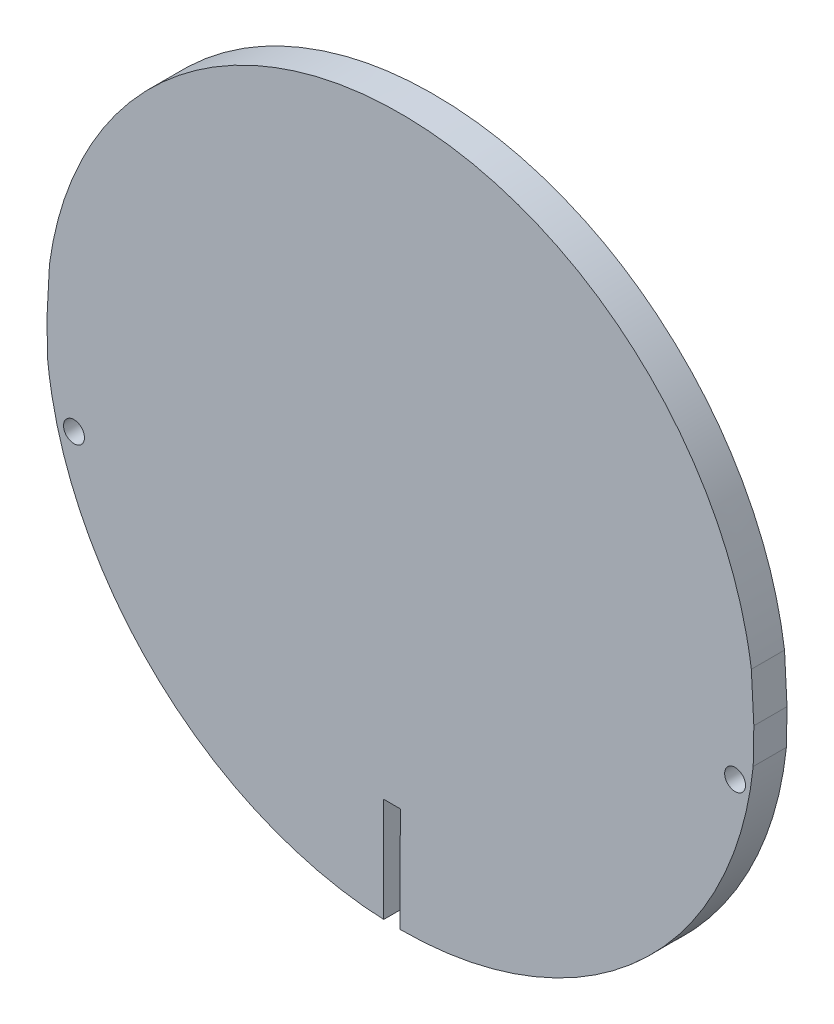
ISO-10303-21;
HEADER;
FILE_DESCRIPTION(('STEP AP214'),'2;1');
FILE_NAME('part.step','',(''),(''),'','','');
FILE_SCHEMA(('AUTOMOTIVE_DESIGN { 1 0 10303 214 1 1 1 1 }'));
ENDSEC;
DATA;
#1=APPLICATION_CONTEXT('core data for automotive mechanical design processes');
#2=APPLICATION_PROTOCOL_DEFINITION('international standard','automotive_design',2000,#1);
#3=PRODUCT_CONTEXT('',#1,'mechanical');
#4=PRODUCT('Part','Part','',(#3));
#5=PRODUCT_RELATED_PRODUCT_CATEGORY('part','',(#4));
#6=PRODUCT_DEFINITION_FORMATION('','',#4);
#7=PRODUCT_DEFINITION_CONTEXT('part definition',#1,'design');
#8=PRODUCT_DEFINITION('design','',#6,#7);
#9=PRODUCT_DEFINITION_SHAPE('','',#8);
#10=(LENGTH_UNIT() NAMED_UNIT(*) SI_UNIT(.MILLI.,.METRE.));
#11=(NAMED_UNIT(*) PLANE_ANGLE_UNIT() SI_UNIT($,.RADIAN.));
#12=(NAMED_UNIT(*) SI_UNIT($,.STERADIAN.) SOLID_ANGLE_UNIT());
#13=UNCERTAINTY_MEASURE_WITH_UNIT(LENGTH_MEASURE(1.E-05),#10,'distance_accuracy_value','');
#14=(GEOMETRIC_REPRESENTATION_CONTEXT(3) GLOBAL_UNCERTAINTY_ASSIGNED_CONTEXT((#13)) GLOBAL_UNIT_ASSIGNED_CONTEXT((#10,
#11,#12)) REPRESENTATION_CONTEXT('',''));
#15=CARTESIAN_POINT('',(0.,0.,0.));
#16=DIRECTION('',(0.,0.,1.));
#17=DIRECTION('',(1.,0.,0.));
#18=AXIS2_PLACEMENT_3D('',#15,#16,#17);
#19=CARTESIAN_POINT('',(-33.7401472515028,-3.41884717440255,374.0343746217));
#20=CARTESIAN_POINT('',(-33.5219134346699,-5.49673974408785,374.0343746217));
#21=CARTESIAN_POINT('',(-33.1217586079544,-7.52360336030338,374.0343746217));
#22=CARTESIAN_POINT('',(-32.2456554666281,-10.4865168297179,374.0343746217));
#23=CARTESIAN_POINT('',(-31.7386470445697,-11.9486311258385,374.0343746217));
#24=CARTESIAN_POINT('',(-31.1277553781005,-13.3816061089751,374.0343746217));
#25=CARTESIAN_POINT('',(-30.6973662683452,-14.3304353467333,374.0343746217));
#26=CARTESIAN_POINT('',(-30.4703785723469,-14.8019000588231,374.0343746217));
#27=CARTESIAN_POINT('',(-29.2902117325403,-17.1196124406314,374.0343746217));
#28=CARTESIAN_POINT('',(-27.6449305064317,-19.7403337772427,374.0343746217));
#29=CARTESIAN_POINT('',(-25.646898465304,-22.1138572841173,374.0343746217));
#30=CARTESIAN_POINT('',(-24.5883768170115,-23.2589191706647,374.0343746217));
#31=CARTESIAN_POINT('',(-24.2247269148998,-23.6345217184511,374.0343746217));
#32=CARTESIAN_POINT('',(-23.4820127847481,-24.3673271482495,374.0343746217));
#33=CARTESIAN_POINT('',(-21.5901477401273,-26.1504244492688,374.0343746217));
#34=CARTESIAN_POINT('',(-18.7056708268071,-28.3178618450069,374.0343746217));
#35=CARTESIAN_POINT('',(-15.9807867113066,-29.8236057129874,374.0343746217));
#36=CARTESIAN_POINT('',(-14.1070067716983,-30.7476866698165,374.0343746217));
#37=CARTESIAN_POINT('',(-13.1527010835454,-31.164175695453,374.0343746217));
#38=CARTESIAN_POINT('',(-10.2562424757701,-32.2793477501952,374.0343746217));
#39=CARTESIAN_POINT('',(-7.77796089328067,-32.988270972225,374.0343746217));
#40=CARTESIAN_POINT('',(-5.21433965591233,-33.4058998082986,374.0343746217));
#41=CARTESIAN_POINT('',(-4.18196798537004,-33.5493200990036,374.0343746217));
#42=CARTESIAN_POINT('',(-3.66132830753749,-33.6092558601464,374.0343746217));
#43=CARTESIAN_POINT('',(-2.10453268143531,-33.7519977589989,374.0343746217));
#44=CARTESIAN_POINT('',(-1.06921386927955,-33.7985427644596,374.0343746217));
#45=CARTESIAN_POINT('',(2.02959764384909,-33.8016874715165,374.0343746217));
#46=CARTESIAN_POINT('',(4.08596214071679,-33.6221162532679,374.0343746217));
#47=CARTESIAN_POINT('',(7.15511700382936,-33.0587264934906,374.0343746217));
#48=CARTESIAN_POINT('',(8.17808125657162,-32.8206708517667,374.0343746217));
#49=CARTESIAN_POINT('',(10.1770009779513,-32.2565776331426,374.0343746217));
#50=CARTESIAN_POINT('',(11.1581047667066,-31.9298887420901,374.0343746217));
#51=CARTESIAN_POINT('',(14.0493649699348,-30.823232747779,374.0343746217));
#52=CARTESIAN_POINT('',(15.9079360314546,-29.9178091814807,374.0343746217));
#53=CARTESIAN_POINT('',(18.1367329395038,-28.5564061577701,374.0343746217));
#54=CARTESIAN_POINT('',(18.5768891041864,-28.2730876142728,374.0343746217));
#55=CARTESIAN_POINT('',(19.4387101347957,-27.6894607286162,374.0343746217));
#56=CARTESIAN_POINT('',(20.7069732529225,-26.7865737608581,374.0343746217));
#57=CARTESIAN_POINT('',(21.9036315165537,-25.8033664460532,374.0343746217));
#58=CARTESIAN_POINT('',(23.438553372088,-24.4244221054054,374.0343746217));
#59=CARTESIAN_POINT('',(24.5444118429601,-23.3393631645124,374.0343746217));
#60=CARTESIAN_POINT('',(25.5786405388952,-22.1739559229024,374.0343746217));
#61=CARTESIAN_POINT('',(26.251776295938,-21.3786776518443,374.0343746217));
#62=CARTESIAN_POINT('',(26.5809697228596,-20.9707785150517,374.0343746217));
#63=CARTESIAN_POINT('',(28.1709466197994,-18.9029253335801,374.0343746217));
#64=CARTESIAN_POINT('',(29.269671396597,-17.1528992217387,374.0343746217));
#65=CARTESIAN_POINT('',(30.6789072870612,-14.3958682316347,374.0343746217));
#66=CARTESIAN_POINT('',(31.1088211759449,-13.45484663067,374.0343746217));
#67=CARTESIAN_POINT('',(31.8840533739668,-11.5260549877065,374.0343746217));
#68=CARTESIAN_POINT('',(32.230015293159,-10.5349072164197,374.0343746217));
#69=CARTESIAN_POINT('',(33.1196381142277,-7.53930280297371,374.0343746217));
#70=CARTESIAN_POINT('',(33.5216512280803,-5.49956295766788,374.0343746217));
#71=CARTESIAN_POINT('',(33.7401820483116,-3.41884711737329,374.0343746217));
#72=B_SPLINE_CURVE_WITH_KNOTS('',3,(#19,#20,#21,#22,#23,#24,#25,#26,#27,#28,#29,#30,#31,#32,#33,
#34,#35,#36,#37,#38,#39,#40,#41,#42,#43,#44,#45,#46,#47,#48,#49,#50,#51,#52,#53,#54,#55,#56,#57,
#58,#59,#60,#61,#62,#63,#64,#65,#66,#67,#68,#69,#70,#71),.UNSPECIFIED.,.F.,.F.,(4,2,1,2,2,1,2,2,
1,1,2,2,1,2,2,2,2,2,2,2,2,1,2,1,2,2,2,2,2,4),(0.,0.0625000000000002,0.0937500000000003,0.109375,
0.125,0.187500000000001,0.218750000000001,0.234375000000001,0.250000000000001,0.312500000000001,
0.343750000000001,0.375000000000001,0.437500000000001,0.453125000000001,0.468750000000001,
0.500000000000001,0.5625,0.59375,0.625,0.6875,0.703125,0.71875,0.75,0.78125,0.796875,0.8125,
0.875,0.90625,0.9375,1.),.UNSPECIFIED.);
#73=DIRECTION('',(0.,0.,1.));
#74=VECTOR('',#73,1.);
#75=SURFACE_OF_LINEAR_EXTRUSION('',#72,#74);
#76=CARTESIAN_POINT('',(33.7401820483116,-3.41884711737329,377.2093746217));
#77=CARTESIAN_POINT('',(33.5216512280803,-5.49956295766788,377.2093746217));
#78=CARTESIAN_POINT('',(33.1196381142277,-7.53930280297371,377.2093746217));
#79=CARTESIAN_POINT('',(32.230015293159,-10.5349072164197,377.2093746217));
#80=CARTESIAN_POINT('',(31.8840533739668,-11.5260549877065,377.2093746217));
#81=CARTESIAN_POINT('',(31.1088211759449,-13.45484663067,377.2093746217));
#82=CARTESIAN_POINT('',(30.6789072870612,-14.3958682316347,377.2093746217));
#83=CARTESIAN_POINT('',(29.269671396597,-17.1528992217387,377.2093746217));
#84=CARTESIAN_POINT('',(28.1709466197994,-18.9029253335801,377.2093746217));
#85=CARTESIAN_POINT('',(26.5809697228596,-20.9707785150517,377.2093746217));
#86=CARTESIAN_POINT('',(26.251776295938,-21.3786776518443,377.2093746217));
#87=CARTESIAN_POINT('',(25.5786405388952,-22.1739559229024,377.2093746217));
#88=CARTESIAN_POINT('',(24.5444118429601,-23.3393631645124,377.2093746217));
#89=CARTESIAN_POINT('',(23.438553372088,-24.4244221054054,377.2093746217));
#90=CARTESIAN_POINT('',(21.9036315165537,-25.8033664460532,377.2093746217));
#91=CARTESIAN_POINT('',(20.7069732529225,-26.7865737608581,377.2093746217));
#92=CARTESIAN_POINT('',(19.4387101347957,-27.6894607286162,377.2093746217));
#93=CARTESIAN_POINT('',(18.5768891041864,-28.2730876142728,377.2093746217));
#94=CARTESIAN_POINT('',(18.1367329395038,-28.5564061577701,377.2093746217));
#95=CARTESIAN_POINT('',(15.9079360314546,-29.9178091814807,377.2093746217));
#96=CARTESIAN_POINT('',(14.0493649699348,-30.823232747779,377.2093746217));
#97=CARTESIAN_POINT('',(11.1581047667066,-31.9298887420901,377.2093746217));
#98=CARTESIAN_POINT('',(10.1770009779513,-32.2565776331426,377.2093746217));
#99=CARTESIAN_POINT('',(8.17808125657162,-32.8206708517667,377.2093746217));
#100=CARTESIAN_POINT('',(7.15511700382936,-33.0587264934906,377.2093746217));
#101=CARTESIAN_POINT('',(4.09178396282777,-33.6210475698332,377.2093746217));
#102=CARTESIAN_POINT('',(2.04129959814083,-33.8006640087557,377.2093746217));
#103=CARTESIAN_POINT('',(-0.0186426974678636,-33.7996044829551,377.2093746217));
#104=B_SPLINE_CURVE_WITH_KNOTS('',3,(#76,#77,#78,#79,#80,#81,#82,#83,#84,#85,#86,#87,#88,#89,
#90,#91,#92,#93,#94,#95,#96,#97,#98,#99,#100,#101,#102,#103),.UNSPECIFIED.,.F.,.F.,(4,2,2,2,2,2,
1,2,1,2,2,2,2,2,4),(0.500177832611012,0.562677832611011,0.593927832611011,0.625177832611011,
0.687677832611011,0.703302832611011,0.718927832611011,0.750177832611011,0.781427832611011,
0.797052832611011,0.812677832611011,0.875177832611011,0.906427832611011,0.937677832611011,1.),.UNSPECIFIED.);
#105=CARTESIAN_POINT('',(-0.0186426974562713,-33.7996044829551,377.2093746217));
#106=VERTEX_POINT('',#105);
#107=CARTESIAN_POINT('',(33.7401820483116,-3.41884711737329,377.2093746217));
#108=VERTEX_POINT('',#107);
#109=EDGE_CURVE('E277',#106,#108,#104,.F.);
#110=ORIENTED_EDGE('',*,*,#109,.F.);
#111=DIRECTION('',(0.,0.,1.));
#112=VECTOR('',#111,1.);
#113=CARTESIAN_POINT('',(-0.0186426974562744,-33.7996044829551,370.559262624631));
#114=LINE('',#113,#112);
#115=CARTESIAN_POINT('',(-0.0186426974562744,-33.7996044829551,374.0343746217));
#116=VERTEX_POINT('',#115);
#117=EDGE_CURVE('E314',#116,#106,#114,.T.);
#118=ORIENTED_EDGE('',*,*,#117,.F.);
#119=CARTESIAN_POINT('',(-0.0186426974458457,-33.7996044829551,374.0343746217));
#120=CARTESIAN_POINT('',(2.04129959815544,-33.8006640087544,374.0343746217));
#121=CARTESIAN_POINT('',(4.09178396283504,-33.6210475698319,374.0343746217));
#122=CARTESIAN_POINT('',(7.15511700382936,-33.0587264934906,374.0343746217));
#123=CARTESIAN_POINT('',(8.17808125657162,-32.8206708517667,374.0343746217));
#124=CARTESIAN_POINT('',(10.1770009779513,-32.2565776331426,374.0343746217));
#125=CARTESIAN_POINT('',(11.1581047667066,-31.9298887420901,374.0343746217));
#126=CARTESIAN_POINT('',(14.0493649699348,-30.823232747779,374.0343746217));
#127=CARTESIAN_POINT('',(15.9079360314546,-29.9178091814807,374.0343746217));
#128=CARTESIAN_POINT('',(18.1367329395038,-28.5564061577701,374.0343746217));
#129=CARTESIAN_POINT('',(18.5768891041864,-28.2730876142728,374.0343746217));
#130=CARTESIAN_POINT('',(19.4387101347957,-27.6894607286162,374.0343746217));
#131=CARTESIAN_POINT('',(20.7069732529225,-26.7865737608581,374.0343746217));
#132=CARTESIAN_POINT('',(21.9036315165537,-25.8033664460532,374.0343746217));
#133=CARTESIAN_POINT('',(23.438553372088,-24.4244221054054,374.0343746217));
#134=CARTESIAN_POINT('',(24.5444118429601,-23.3393631645124,374.0343746217));
#135=CARTESIAN_POINT('',(25.5786405388952,-22.1739559229024,374.0343746217));
#136=CARTESIAN_POINT('',(26.251776295938,-21.3786776518443,374.0343746217));
#137=CARTESIAN_POINT('',(26.5809697228596,-20.9707785150517,374.0343746217));
#138=CARTESIAN_POINT('',(28.1709466197994,-18.9029253335801,374.0343746217));
#139=CARTESIAN_POINT('',(29.269671396597,-17.1528992217387,374.0343746217));
#140=CARTESIAN_POINT('',(30.6789072870612,-14.3958682316347,374.0343746217));
#141=CARTESIAN_POINT('',(31.1088211759449,-13.45484663067,374.0343746217));
#142=CARTESIAN_POINT('',(31.8840533739668,-11.5260549877065,374.0343746217));
#143=CARTESIAN_POINT('',(32.230015293159,-10.5349072164197,374.0343746217));
#144=CARTESIAN_POINT('',(33.1196381142277,-7.53930280297371,374.0343746217));
#145=CARTESIAN_POINT('',(33.5216512280803,-5.49956295766788,374.0343746217));
#146=CARTESIAN_POINT('',(33.7401820483116,-3.41884711737329,374.0343746217));
#147=B_SPLINE_CURVE_WITH_KNOTS('',3,(#119,#120,#121,#122,#123,#124,#125,#126,#127,#128,#129,
#130,#131,#132,#133,#134,#135,#136,#137,#138,#139,#140,#141,#142,#143,#144,#145,#146),
.UNSPECIFIED.,.F.,.F.,(4,2,2,2,2,2,1,2,1,2,2,2,2,2,4),(0.500177832611233,0.5625,0.59375,0.625,
0.6875,0.703125,0.71875,0.75,0.78125,0.796875,0.8125,0.875,0.90625,0.9375,1.),.UNSPECIFIED.);
#148=CARTESIAN_POINT('',(33.7401820483116,-3.41884711737329,374.0343746217));
#149=VERTEX_POINT('',#148);
#150=EDGE_CURVE('E136',#116,#149,#147,.T.);
#151=ORIENTED_EDGE('',*,*,#150,.T.);
#152=DIRECTION('',(0.,0.,1.));
#153=VECTOR('',#152,1.);
#154=CARTESIAN_POINT('',(33.7401820483116,-3.41884711737329,374.0343746217));
#155=LINE('',#154,#153);
#156=EDGE_CURVE('E120',#149,#108,#155,.T.);
#157=ORIENTED_EDGE('',*,*,#156,.T.);
#158=EDGE_LOOP('',(#110,#118,#151,#157));
#159=FACE_BOUND('',#158,.T.);
#160=ADVANCED_FACE('F38',(#159),#75,.T.);
#161=CARTESIAN_POINT('',(-0.0362766982367262,-33.7995910001452,374.0343746217));
#162=DIRECTION('',(0.,0.,-1.));
#163=DIRECTION('',(-1.,0.,0.));
#164=AXIS2_PLACEMENT_3D('',#161,#162,#163);
#165=PLANE('',#164);
#166=CARTESIAN_POINT('',(32.0093023749139,-5.35898951564747,374.0343746217));
#167=DIRECTION('',(0.,0.,1.));
#168=DIRECTION('',(1.,0.,0.));
#169=AXIS2_PLACEMENT_3D('',#166,#167,#168);
#170=CIRCLE('',#169,0.999999999998764);
#171=CARTESIAN_POINT('',(33.0093023749126,-5.35898951564747,374.0343746217));
#172=VERTEX_POINT('',#171);
#173=EDGE_CURVE('E205',#172,#172,#170,.T.);
#174=ORIENTED_EDGE('',*,*,#173,.T.);
#175=EDGE_LOOP('',(#174));
#176=FACE_BOUND('',#175,.T.);
#177=CARTESIAN_POINT('',(-31.2160643993176,-8.16443665346959,374.0343746217));
#178=DIRECTION('',(0.,0.,1.));
#179=DIRECTION('',(1.,0.,0.));
#180=AXIS2_PLACEMENT_3D('',#177,#178,#179);
#181=CIRCLE('',#180,1.);
#182=CARTESIAN_POINT('',(-30.2160643993176,-8.16443665346959,374.0343746217));
#183=VERTEX_POINT('',#182);
#184=EDGE_CURVE('E234',#183,#183,#181,.T.);
#185=ORIENTED_EDGE('',*,*,#184,.T.);
#186=EDGE_LOOP('',(#185));
#187=FACE_BOUND('',#186,.T.);
#188=ORIENTED_EDGE('',*,*,#150,.F.);
#189=DIRECTION('',(-0.00055156546668725,-0.999999847887756,0.));
#190=VECTOR('',#189,1.);
#191=CARTESIAN_POINT('',(0.,0.,374.0343746217));
#192=LINE('',#191,#190);
#193=CARTESIAN_POINT('',(-0.0131270419666224,-23.7996045123723,374.0343746217));
#194=VERTEX_POINT('',#193);
#195=EDGE_CURVE('E337',#194,#116,#192,.T.);
#196=ORIENTED_EDGE('',*,*,#195,.F.);
#197=DIRECTION('',(1.,0.,0.));
#198=VECTOR('',#197,1.);
#199=CARTESIAN_POINT('',(0.,-23.7996045123723,374.0343746217));
#200=LINE('',#199,#198);
#201=CARTESIAN_POINT('',(-1.60062704196662,-23.7996045123723,374.0343746217));
#202=VERTEX_POINT('',#201);
#203=EDGE_CURVE('E341',#202,#194,#200,.T.);
#204=ORIENTED_EDGE('',*,*,#203,.F.);
#205=DIRECTION('',(0.,-1.,0.));
#206=VECTOR('',#205,1.);
#207=CARTESIAN_POINT('',(-1.60062704196663,0.,374.0343746217));
#208=LINE('',#207,#206);
#209=CARTESIAN_POINT('',(-1.60062704196662,-33.7628951620284,374.0343746217));
#210=VERTEX_POINT('',#209);
#211=EDGE_CURVE('E309',#202,#210,#208,.T.);
#212=ORIENTED_EDGE('',*,*,#211,.T.);
#213=CARTESIAN_POINT('',(-33.7401472515028,-3.41884717440255,374.0343746217));
#214=CARTESIAN_POINT('',(-33.5219134346699,-5.49673974408785,374.0343746217));
#215=CARTESIAN_POINT('',(-33.1217586079544,-7.52360336030338,374.0343746217));
#216=CARTESIAN_POINT('',(-32.2456554666281,-10.4865168297179,374.0343746217));
#217=CARTESIAN_POINT('',(-31.7386470445697,-11.9486311258385,374.0343746217));
#218=CARTESIAN_POINT('',(-31.1277553781005,-13.3816061089751,374.0343746217));
#219=CARTESIAN_POINT('',(-30.6973662683452,-14.3304353467333,374.0343746217));
#220=CARTESIAN_POINT('',(-30.4703785723469,-14.8019000588231,374.0343746217));
#221=CARTESIAN_POINT('',(-29.2902117325403,-17.1196124406314,374.0343746217));
#222=CARTESIAN_POINT('',(-27.6449305064317,-19.7403337772427,374.0343746217));
#223=CARTESIAN_POINT('',(-25.646898465304,-22.1138572841173,374.0343746217));
#224=CARTESIAN_POINT('',(-24.5883768170115,-23.2589191706647,374.0343746217));
#225=CARTESIAN_POINT('',(-24.2247269148998,-23.6345217184511,374.0343746217));
#226=CARTESIAN_POINT('',(-23.4820127847481,-24.3673271482495,374.0343746217));
#227=CARTESIAN_POINT('',(-21.5901477401273,-26.1504244492688,374.0343746217));
#228=CARTESIAN_POINT('',(-18.7056708268071,-28.3178618450069,374.0343746217));
#229=CARTESIAN_POINT('',(-15.9807867113066,-29.8236057129874,374.0343746217));
#230=CARTESIAN_POINT('',(-14.1070067716983,-30.7476866698165,374.0343746217));
#231=CARTESIAN_POINT('',(-13.1527010835454,-31.164175695453,374.0343746217));
#232=CARTESIAN_POINT('',(-10.2562424757701,-32.2793477501952,374.0343746217));
#233=CARTESIAN_POINT('',(-7.77796089328067,-32.988270972225,374.0343746217));
#234=CARTESIAN_POINT('',(-5.21433965591233,-33.4058998082986,374.0343746217));
#235=CARTESIAN_POINT('',(-4.18196798537004,-33.5493200990036,374.0343746217));
#236=CARTESIAN_POINT('',(-3.66132830753749,-33.6092558601464,374.0343746217));
#237=CARTESIAN_POINT('',(-2.62785466297365,-33.704014599165,374.0343746217));
#238=CARTESIAN_POINT('',(-2.1139384090079,-33.7392434143478,374.0343746217));
#239=CARTESIAN_POINT('',(-1.60062777177367,-33.7629030620113,374.0343746217));
#240=B_SPLINE_CURVE_WITH_KNOTS('',3,(#213,#214,#215,#216,#217,#218,#219,#220,#221,#222,#223,
#224,#225,#226,#227,#228,#229,#230,#231,#232,#233,#234,#235,#236,#237,#238,#239),.UNSPECIFIED.,
.F.,.F.,(4,2,1,2,2,1,2,2,1,1,2,2,1,2,2,4),(0.,0.0625000000000002,0.0937500000000003,0.109375,
0.125,0.187500000000001,0.218750000000001,0.234375000000001,0.250000000000001,0.312500000000001,
0.343750000000001,0.375000000000001,0.437500000000001,0.453125000000001,0.468750000000001,
0.48424281423116),.UNSPECIFIED.);
#241=CARTESIAN_POINT('',(-33.7401472515028,-3.41884717440255,374.0343746217));
#242=VERTEX_POINT('',#241);
#243=EDGE_CURVE('E133',#242,#210,#240,.T.);
#244=ORIENTED_EDGE('',*,*,#243,.F.);
#245=DIRECTION('',(0.0174524064371546,-0.999847695156394,0.));
#246=VECTOR('',#245,1.);
#247=CARTESIAN_POINT('',(-33.7995254554744,-0.0170721471381322,374.0343746217));
#248=LINE('',#247,#246);
#249=CARTESIAN_POINT('',(-33.7995254554744,-0.0170721471381322,374.0343746217));
#250=VERTEX_POINT('',#249);
#251=EDGE_CURVE('E273',#250,#242,#248,.T.);
#252=ORIENTED_EDGE('',*,*,#251,.F.);
#253=DIRECTION('',(-0.052335956242939,-0.998629534754574,0.));
#254=VECTOR('',#253,1.);
#255=CARTESIAN_POINT('',(-33.560377663928,4.54613955192814,374.0343746217));
#256=LINE('',#255,#254);
#257=CARTESIAN_POINT('',(-33.560377663928,4.54613955192816,374.0343746217));
#258=VERTEX_POINT('',#257);
#259=EDGE_CURVE('E272',#258,#250,#256,.T.);
#260=ORIENTED_EDGE('',*,*,#259,.F.);
#261=CARTESIAN_POINT('',(33.5604124567753,4.54613960853345,374.0343746217));
#262=CARTESIAN_POINT('',(33.2820653987906,6.56737437943534,374.0343746217));
#263=CARTESIAN_POINT('',(32.8313728032903,8.53423069122965,374.0343746217));
#264=CARTESIAN_POINT('',(31.8946269220487,11.4022568974663,374.0343746217));
#265=CARTESIAN_POINT('',(31.3610874010579,12.8157086429951,374.0343746217));
#266=CARTESIAN_POINT('',(30.7294917793295,14.1982217304009,374.0343746217));
#267=CARTESIAN_POINT('',(30.2866101478498,15.1130131439712,374.0343746217));
#268=CARTESIAN_POINT('',(30.0537010753112,15.5679250066728,374.0343746217));
#269=CARTESIAN_POINT('',(28.8457427014744,17.8052952917493,374.0343746217));
#270=CARTESIAN_POINT('',(27.7361738495733,19.4878372692615,374.0343746217));
#271=CARTESIAN_POINT('',(25.8528558013397,21.8474990802839,374.0343746217));
#272=CARTESIAN_POINT('',(25.188593752061,22.6066980612392,374.0343746217));
#273=CARTESIAN_POINT('',(23.786460552021,24.0699135432291,374.0343746217));
#274=CARTESIAN_POINT('',(23.0450594456398,24.7766408289273,374.0343746217));
#275=CARTESIAN_POINT('',(20.7523281348932,26.7782840290484,374.0343746217));
#276=CARTESIAN_POINT('',(18.3110677460307,28.5581591218249,374.0343746217));
#277=CARTESIAN_POINT('',(15.6406478983997,29.9958772437517,374.0343746217));
#278=CARTESIAN_POINT('',(14.2667399957213,30.6569565242211,374.0343746217));
#279=CARTESIAN_POINT('',(13.8011410837962,30.8681630079769,374.0343746217));
#280=CARTESIAN_POINT('',(12.8647588873635,31.2679718529554,374.0343746217));
#281=CARTESIAN_POINT('',(12.3936994612774,31.4567831926255,374.0343746217));
#282=CARTESIAN_POINT('',(10.0246059650265,32.3474832889447,374.0343746217));
#283=CARTESIAN_POINT('',(7.11527976519426,33.1594712998069,374.0343746217));
#284=CARTESIAN_POINT('',(4.10232218038758,33.570671259807,374.0343746217));
#285=CARTESIAN_POINT('',(2.07021332223554,33.7540339641368,374.0343746217));
#286=CARTESIAN_POINT('',(1.05366216131143,33.7991469509523,374.0343746217));
#287=CARTESIAN_POINT('',(-1.97866322866921,33.8028023855291,374.0343746217));
#288=CARTESIAN_POINT('',(-4.48722038602584,33.5876812691688,374.0343746217));
#289=CARTESIAN_POINT('',(-6.9715007299331,33.0844091869291,374.0343746217));
#290=CARTESIAN_POINT('',(-7.96324362195128,32.8597266107306,374.0343746217));
#291=CARTESIAN_POINT('',(-8.4593996147349,32.7353306897467,374.0343746217));
#292=CARTESIAN_POINT('',(-9.93366921730277,32.3298054351655,374.0343746217));
#293=CARTESIAN_POINT('',(-10.8973653065333,32.016750487259,374.0343746217));
#294=CARTESIAN_POINT('',(-13.7346096462486,30.9575148612428,374.0343746217));
#295=CARTESIAN_POINT('',(-15.554750032773,30.0922358140582,374.0343746217));
#296=CARTESIAN_POINT('',(-17.7346735714331,28.7982272511699,374.0343746217));
#297=CARTESIAN_POINT('',(-18.1658935427174,28.5288002804764,374.0343746217));
#298=CARTESIAN_POINT('',(-19.0186453742721,27.9683420633217,374.0343746217));
#299=CARTESIAN_POINT('',(-19.4391876131215,27.677889019477,374.0343746217));
#300=CARTESIAN_POINT('',(-20.6739523625416,26.7831794449682,374.0343746217));
#301=CARTESIAN_POINT('',(-21.4652076756434,26.1530693842164,374.0343746217));
#302=CARTESIAN_POINT('',(-23.7487172604649,24.1676313965341,374.0343746217));
#303=CARTESIAN_POINT('',(-25.151109466385,22.7176111466286,374.0343746217));
#304=CARTESIAN_POINT('',(-26.7425075256197,20.7348077476841,374.0343746217));
#305=CARTESIAN_POINT('',(-27.0534367564324,20.3287028351869,374.0343746217));
#306=CARTESIAN_POINT('',(-27.6549586448929,19.5045017591262,374.0343746217));
#307=CARTESIAN_POINT('',(-28.5256821856912,18.2520117565887,374.0343746217));
#308=CARTESIAN_POINT('',(-29.3043492989201,16.9523012646445,374.0343746217));
#309=CARTESIAN_POINT('',(-30.7454836560348,14.293275374893,374.0343746217));
#310=CARTESIAN_POINT('',(-31.551336522558,12.4411335201558,374.0343746217));
#311=CARTESIAN_POINT('',(-32.506911863443,9.53303936882196,374.0343746217));
#312=CARTESIAN_POINT('',(-32.7810553240917,8.54772864691103,374.0343746217));
#313=CARTESIAN_POINT('',(-33.2376341924846,6.56190951935685,374.0343746217));
#314=CARTESIAN_POINT('',(-33.4209052816291,5.55892536190125,374.0343746217));
#315=CARTESIAN_POINT('',(-33.560377663928,4.54613955192816,374.0343746217));
#316=B_SPLINE_CURVE_WITH_KNOTS('',3,(#261,#262,#263,#264,#265,#266,#267,#268,#269,#270,#271,
#272,#273,#274,#275,#276,#277,#278,#279,#280,#281,#282,#283,#284,#285,#286,#287,#288,#289,#290,
#291,#292,#293,#294,#295,#296,#297,#298,#299,#300,#301,#302,#303,#304,#305,#306,#307,#308,#309,
#310,#311,#312,#313,#314,#315),.UNSPECIFIED.,.F.,.F.,(4,2,1,2,2,2,2,2,1,2,2,2,1,2,2,1,2,2,2,2,2,
2,2,2,2,1,2,2,2,4),(0.,0.0625,0.09375,0.109375,0.125,0.1875,0.21875,0.25,0.3125,0.34375,
0.359375,0.375,0.4375,0.46875,0.5,0.5625,0.578125,0.59375,0.625,0.6875,0.703125,0.71875,0.75,
0.8125,0.828125,0.84375,0.875,0.9375,0.96875,1.),.UNSPECIFIED.);
#317=CARTESIAN_POINT('',(33.5604124567753,4.54613960853345,374.0343746217));
#318=VERTEX_POINT('',#317);
#319=EDGE_CURVE('E127',#318,#258,#316,.T.);
#320=ORIENTED_EDGE('',*,*,#319,.F.);
#321=DIRECTION('',(-0.0523359562429329,0.998629534754574,0.));
#322=VECTOR('',#321,1.);
#323=CARTESIAN_POINT('',(33.7995602512882,-0.0170721471381168,374.0343746217));
#324=LINE('',#323,#322);
#325=CARTESIAN_POINT('',(33.7995602512882,-0.0170721471381168,374.0343746217));
#326=VERTEX_POINT('',#325);
#327=EDGE_CURVE('E112',#326,#318,#324,.T.);
#328=ORIENTED_EDGE('',*,*,#327,.F.);
#329=DIRECTION('',(0.0174524064372837,0.999847695156391,0.));
#330=VECTOR('',#329,1.);
#331=CARTESIAN_POINT('',(33.7401820483116,-3.41884711737331,374.0343746217));
#332=LINE('',#331,#330);
#333=EDGE_CURVE('E126',#149,#326,#332,.T.);
#334=ORIENTED_EDGE('',*,*,#333,.F.);
#335=EDGE_LOOP('',(#188,#196,#204,#212,#244,#252,#260,#320,#328,#334));
#336=FACE_BOUND('',#335,.T.);
#337=ADVANCED_FACE('F125',(#176,#187,#336),#165,.T.);
#338=CARTESIAN_POINT('',(-0.0362766982367262,-33.7995910001452,377.2093746217));
#339=DIRECTION('',(0.,0.,-1.));
#340=DIRECTION('',(-1.,0.,0.));
#341=AXIS2_PLACEMENT_3D('',#338,#339,#340);
#342=PLANE('',#341);
#343=CARTESIAN_POINT('',(-31.2160643993176,-8.16443665346959,377.2093746217));
#344=DIRECTION('',(0.,0.,1.));
#345=DIRECTION('',(1.,0.,0.));
#346=AXIS2_PLACEMENT_3D('',#343,#344,#345);
#347=CIRCLE('',#346,1.);
#348=CARTESIAN_POINT('',(-30.2160643993176,-8.16443665346959,377.2093746217));
#349=VERTEX_POINT('',#348);
#350=EDGE_CURVE('E332',#349,#349,#347,.T.);
#351=ORIENTED_EDGE('',*,*,#350,.F.);
#352=EDGE_LOOP('',(#351));
#353=FACE_BOUND('',#352,.T.);
#354=CARTESIAN_POINT('',(32.0093023749139,-5.35898951564747,377.2093746217));
#355=DIRECTION('',(0.,0.,1.));
#356=DIRECTION('',(1.,0.,0.));
#357=AXIS2_PLACEMENT_3D('',#354,#355,#356);
#358=CIRCLE('',#357,0.999999999998764);
#359=CARTESIAN_POINT('',(33.0093023749126,-5.35898951564747,377.2093746217));
#360=VERTEX_POINT('',#359);
#361=EDGE_CURVE('E330',#360,#360,#358,.T.);
#362=ORIENTED_EDGE('',*,*,#361,.F.);
#363=EDGE_LOOP('',(#362));
#364=FACE_BOUND('',#363,.T.);
#365=DIRECTION('',(-0.00055156546668725,-0.999999847887756,0.));
#366=VECTOR('',#365,1.);
#367=CARTESIAN_POINT('',(0.,0.,377.2093746217));
#368=LINE('',#367,#366);
#369=CARTESIAN_POINT('',(-0.0131270419666224,-23.7996045123723,377.2093746217));
#370=VERTEX_POINT('',#369);
#371=EDGE_CURVE('E55',#370,#106,#368,.T.);
#372=ORIENTED_EDGE('',*,*,#371,.T.);
#373=ORIENTED_EDGE('',*,*,#109,.T.);
#374=DIRECTION('',(0.0174524064372837,0.999847695156391,0.));
#375=VECTOR('',#374,1.);
#376=CARTESIAN_POINT('',(33.7401820483116,-3.41884711737331,377.2093746217));
#377=LINE('',#376,#375);
#378=CARTESIAN_POINT('',(33.7995602512882,-0.0170721471381168,377.2093746217));
#379=VERTEX_POINT('',#378);
#380=EDGE_CURVE('E198',#108,#379,#377,.T.);
#381=ORIENTED_EDGE('',*,*,#380,.T.);
#382=DIRECTION('',(-0.0523359562429329,0.998629534754574,0.));
#383=VECTOR('',#382,1.);
#384=CARTESIAN_POINT('',(33.7995602512882,-0.0170721471381168,377.2093746217));
#385=LINE('',#384,#383);
#386=CARTESIAN_POINT('',(33.5604124567753,4.54613960853345,377.2093746217));
#387=VERTEX_POINT('',#386);
#388=EDGE_CURVE('E115',#379,#387,#385,.T.);
#389=ORIENTED_EDGE('',*,*,#388,.T.);
#390=CARTESIAN_POINT('',(-33.560377663928,4.54613955192816,377.2093746217));
#391=CARTESIAN_POINT('',(-33.4209052816291,5.55892536190125,377.2093746217));
#392=CARTESIAN_POINT('',(-33.2376341924846,6.56190951935685,377.2093746217));
#393=CARTESIAN_POINT('',(-32.7810553240917,8.54772864691103,377.2093746217));
#394=CARTESIAN_POINT('',(-32.506911863443,9.53303936882196,377.2093746217));
#395=CARTESIAN_POINT('',(-31.551336522558,12.4411335201558,377.2093746217));
#396=CARTESIAN_POINT('',(-30.7454836560348,14.293275374893,377.2093746217));
#397=CARTESIAN_POINT('',(-29.3043492989201,16.9523012646445,377.2093746217));
#398=CARTESIAN_POINT('',(-28.5256821856912,18.2520117565887,377.2093746217));
#399=CARTESIAN_POINT('',(-27.6549586448929,19.5045017591262,377.2093746217));
#400=CARTESIAN_POINT('',(-27.0534367564324,20.3287028351869,377.2093746217));
#401=CARTESIAN_POINT('',(-26.7425075256197,20.7348077476841,377.2093746217));
#402=CARTESIAN_POINT('',(-25.151109466385,22.7176111466286,377.2093746217));
#403=CARTESIAN_POINT('',(-23.7487172604649,24.1676313965341,377.2093746217));
#404=CARTESIAN_POINT('',(-21.4652076756434,26.1530693842164,377.2093746217));
#405=CARTESIAN_POINT('',(-20.6739523625416,26.7831794449682,377.2093746217));
#406=CARTESIAN_POINT('',(-19.4391876131215,27.677889019477,377.2093746217));
#407=CARTESIAN_POINT('',(-19.0186453742721,27.9683420633217,377.2093746217));
#408=CARTESIAN_POINT('',(-18.1658935427174,28.5288002804764,377.2093746217));
#409=CARTESIAN_POINT('',(-17.7346735714331,28.7982272511699,377.2093746217));
#410=CARTESIAN_POINT('',(-15.554750032773,30.0922358140582,377.2093746217));
#411=CARTESIAN_POINT('',(-13.7346096462486,30.9575148612428,377.2093746217));
#412=CARTESIAN_POINT('',(-10.8973653065333,32.016750487259,377.2093746217));
#413=CARTESIAN_POINT('',(-9.93366921730277,32.3298054351655,377.2093746217));
#414=CARTESIAN_POINT('',(-8.4593996147349,32.7353306897467,377.2093746217));
#415=CARTESIAN_POINT('',(-7.96324362195128,32.8597266107306,377.2093746217));
#416=CARTESIAN_POINT('',(-6.9715007299331,33.0844091869291,377.2093746217));
#417=CARTESIAN_POINT('',(-4.48722038602584,33.5876812691688,377.2093746217));
#418=CARTESIAN_POINT('',(-1.97866322866921,33.8028023855291,377.2093746217));
#419=CARTESIAN_POINT('',(1.05366216131143,33.7991469509523,377.2093746217));
#420=CARTESIAN_POINT('',(2.07021332223554,33.7540339641368,377.2093746217));
#421=CARTESIAN_POINT('',(4.10232218038758,33.570671259807,377.2093746217));
#422=CARTESIAN_POINT('',(7.11527976519426,33.1594712998069,377.2093746217));
#423=CARTESIAN_POINT('',(10.0246059650265,32.3474832889447,377.2093746217));
#424=CARTESIAN_POINT('',(12.3936994612774,31.4567831926255,377.2093746217));
#425=CARTESIAN_POINT('',(12.8647588873635,31.2679718529554,377.2093746217));
#426=CARTESIAN_POINT('',(13.8011410837962,30.8681630079769,377.2093746217));
#427=CARTESIAN_POINT('',(14.2667399957213,30.6569565242211,377.2093746217));
#428=CARTESIAN_POINT('',(15.6406478983997,29.9958772437517,377.2093746217));
#429=CARTESIAN_POINT('',(18.3110677460307,28.5581591218249,377.2093746217));
#430=CARTESIAN_POINT('',(20.7523281348932,26.7782840290484,377.2093746217));
#431=CARTESIAN_POINT('',(23.0450594456398,24.7766408289273,377.2093746217));
#432=CARTESIAN_POINT('',(23.786460552021,24.0699135432291,377.2093746217));
#433=CARTESIAN_POINT('',(25.188593752061,22.6066980612392,377.2093746217));
#434=CARTESIAN_POINT('',(25.8528558013397,21.8474990802839,377.2093746217));
#435=CARTESIAN_POINT('',(27.7361738495733,19.4878372692615,377.2093746217));
#436=CARTESIAN_POINT('',(28.8457427014744,17.8052952917493,377.2093746217));
#437=CARTESIAN_POINT('',(30.0537010753112,15.5679250066728,377.2093746217));
#438=CARTESIAN_POINT('',(30.2866101478498,15.1130131439712,377.2093746217));
#439=CARTESIAN_POINT('',(30.7294917793295,14.1982217304009,377.2093746217));
#440=CARTESIAN_POINT('',(31.3610874010579,12.8157086429951,377.2093746217));
#441=CARTESIAN_POINT('',(31.8946269220487,11.4022568974663,377.2093746217));
#442=CARTESIAN_POINT('',(32.8313728032903,8.53423069122965,377.2093746217));
#443=CARTESIAN_POINT('',(33.2820653987906,6.56737437943534,377.2093746217));
#444=CARTESIAN_POINT('',(33.5604124567753,4.54613960853345,377.2093746217));
#445=B_SPLINE_CURVE_WITH_KNOTS('',3,(#390,#391,#392,#393,#394,#395,#396,#397,#398,#399,#400,
#401,#402,#403,#404,#405,#406,#407,#408,#409,#410,#411,#412,#413,#414,#415,#416,#417,#418,#419,
#420,#421,#422,#423,#424,#425,#426,#427,#428,#429,#430,#431,#432,#433,#434,#435,#436,#437,#438,
#439,#440,#441,#442,#443,#444),.UNSPECIFIED.,.F.,.F.,(4,2,2,2,1,2,2,2,2,2,2,2,2,2,1,2,2,1,2,2,2,
1,2,2,2,2,2,1,2,4),(0.,0.03125,0.0625,0.125,0.15625,0.171875,0.1875,0.25,0.28125,0.296875,
0.3125,0.375,0.40625,0.421875,0.4375,0.5,0.53125,0.5625,0.625,0.640625,0.65625,0.6875,0.75,
0.78125,0.8125,0.875,0.890625,0.90625,0.9375,1.),.UNSPECIFIED.);
#446=CARTESIAN_POINT('',(-33.560377663928,4.54613955192816,377.2093746217));
#447=VERTEX_POINT('',#446);
#448=EDGE_CURVE('E188',#387,#447,#445,.F.);
#449=ORIENTED_EDGE('',*,*,#448,.T.);
#450=DIRECTION('',(-0.052335956242939,-0.998629534754574,0.));
#451=VECTOR('',#450,1.);
#452=CARTESIAN_POINT('',(-33.560377663928,4.54613955192814,377.2093746217));
#453=LINE('',#452,#451);
#454=CARTESIAN_POINT('',(-33.7995254554744,-0.0170721471381322,377.2093746217));
#455=VERTEX_POINT('',#454);
#456=EDGE_CURVE('E201',#447,#455,#453,.T.);
#457=ORIENTED_EDGE('',*,*,#456,.T.);
#458=DIRECTION('',(0.0174524064371546,-0.999847695156394,0.));
#459=VECTOR('',#458,1.);
#460=CARTESIAN_POINT('',(-33.7995254554744,-0.0170721471381322,377.2093746217));
#461=LINE('',#460,#459);
#462=CARTESIAN_POINT('',(-33.7401472515028,-3.41884717440255,377.2093746217));
#463=VERTEX_POINT('',#462);
#464=EDGE_CURVE('E204',#455,#463,#461,.T.);
#465=ORIENTED_EDGE('',*,*,#464,.T.);
#466=CARTESIAN_POINT('',(-1.60062923978061,-33.7629029943475,377.2093746217));
#467=CARTESIAN_POINT('',(-2.11393938883385,-33.739243347181,377.2093746217));
#468=CARTESIAN_POINT('',(-2.62785515348293,-33.7040145541904,377.2093746217));
#469=CARTESIAN_POINT('',(-3.66132830753749,-33.6092558601464,377.2093746217));
#470=CARTESIAN_POINT('',(-4.18196798537004,-33.5493200990036,377.2093746217));
#471=CARTESIAN_POINT('',(-5.21433965591233,-33.4058998082986,377.2093746217));
#472=CARTESIAN_POINT('',(-7.77796089328067,-32.988270972225,377.2093746217));
#473=CARTESIAN_POINT('',(-10.2562424757701,-32.2793477501952,377.2093746217));
#474=CARTESIAN_POINT('',(-13.1527010835454,-31.164175695453,377.2093746217));
#475=CARTESIAN_POINT('',(-14.1070067716983,-30.7476866698165,377.2093746217));
#476=CARTESIAN_POINT('',(-15.9807867113066,-29.8236057129874,377.2093746217));
#477=CARTESIAN_POINT('',(-18.7056708268071,-28.3178618450069,377.2093746217));
#478=CARTESIAN_POINT('',(-21.5901477401273,-26.1504244492688,377.2093746217));
#479=CARTESIAN_POINT('',(-23.4820127847481,-24.3673271482495,377.2093746217));
#480=CARTESIAN_POINT('',(-24.2247269148998,-23.6345217184511,377.2093746217));
#481=CARTESIAN_POINT('',(-24.5883768170115,-23.2589191706647,377.2093746217));
#482=CARTESIAN_POINT('',(-25.646898465304,-22.1138572841173,377.2093746217));
#483=CARTESIAN_POINT('',(-27.6449305064317,-19.7403337772427,377.2093746217));
#484=CARTESIAN_POINT('',(-29.2902117325403,-17.1196124406314,377.2093746217));
#485=CARTESIAN_POINT('',(-30.4703785723469,-14.8019000588231,377.2093746217));
#486=CARTESIAN_POINT('',(-30.6973662683452,-14.3304353467333,377.2093746217));
#487=CARTESIAN_POINT('',(-31.1277553781005,-13.3816061089751,377.2093746217));
#488=CARTESIAN_POINT('',(-31.7386470445697,-11.9486311258385,377.2093746217));
#489=CARTESIAN_POINT('',(-32.2456554666281,-10.4865168297179,377.2093746217));
#490=CARTESIAN_POINT('',(-33.1217586079544,-7.52360336030338,377.2093746217));
#491=CARTESIAN_POINT('',(-33.5219134346699,-5.49673974408785,377.2093746217));
#492=CARTESIAN_POINT('',(-33.7401472515028,-3.41884717440255,377.2093746217));
#493=B_SPLINE_CURVE_WITH_KNOTS('',3,(#466,#467,#468,#469,#470,#471,#472,#473,#474,#475,#476,
#477,#478,#479,#480,#481,#482,#483,#484,#485,#486,#487,#488,#489,#490,#491,#492),.UNSPECIFIED.,
.F.,.F.,(4,2,2,1,2,2,1,1,2,2,1,2,2,1,2,4),(0.,0.0154927994619622,0.0311177994619622,
0.0467427994619622,0.109242799461962,0.140492799461962,0.171742799461962,0.234242799461962,
0.249867799461962,0.265492799461962,0.296742799461962,0.359242799461962,0.374867799461962,
0.390492799461963,0.421742799461963,0.484242799461963),.UNSPECIFIED.);
#494=CARTESIAN_POINT('',(-1.60062813813705,-33.7628791943323,377.2093746217));
#495=VERTEX_POINT('',#494);
#496=EDGE_CURVE('E150',#463,#495,#493,.F.);
#497=ORIENTED_EDGE('',*,*,#496,.T.);
#498=DIRECTION('',(0.,-1.,0.));
#499=VECTOR('',#498,1.);
#500=CARTESIAN_POINT('',(-1.60062704196663,0.,377.2093746217));
#501=LINE('',#500,#499);
#502=CARTESIAN_POINT('',(-1.60062704196662,-23.7996045123723,377.2093746217));
#503=VERTEX_POINT('',#502);
#504=EDGE_CURVE('E345',#503,#495,#501,.T.);
#505=ORIENTED_EDGE('',*,*,#504,.F.);
#506=DIRECTION('',(1.,0.,0.));
#507=VECTOR('',#506,1.);
#508=CARTESIAN_POINT('',(0.,-23.7996045123723,377.2093746217));
#509=LINE('',#508,#507);
#510=EDGE_CURVE('E312',#503,#370,#509,.T.);
#511=ORIENTED_EDGE('',*,*,#510,.T.);
#512=EDGE_LOOP('',(#372,#373,#381,#389,#449,#457,#465,#497,#505,#511));
#513=FACE_BOUND('',#512,.T.);
#514=ADVANCED_FACE('F157',(#353,#364,#513),#342,.F.);
#515=CARTESIAN_POINT('',(-33.560377663928,4.54613955192814,374.0343746217));
#516=DIRECTION('',(-0.998629534754574,0.052335956242939,0.));
#517=DIRECTION('',(-0.052335956242939,-0.998629534754574,0.));
#518=AXIS2_PLACEMENT_3D('',#515,#516,#517);
#519=PLANE('',#518);
#520=ORIENTED_EDGE('',*,*,#456,.F.);
#521=DIRECTION('',(0.,0.,1.));
#522=VECTOR('',#521,1.);
#523=CARTESIAN_POINT('',(-33.560377663928,4.54613955192816,374.0343746217));
#524=LINE('',#523,#522);
#525=EDGE_CURVE('E11',#258,#447,#524,.T.);
#526=ORIENTED_EDGE('',*,*,#525,.F.);
#527=ORIENTED_EDGE('',*,*,#259,.T.);
#528=DIRECTION('',(0.,0.,1.));
#529=VECTOR('',#528,1.);
#530=CARTESIAN_POINT('',(-33.7995254554744,-0.0170721471381322,374.0343746217));
#531=LINE('',#530,#529);
#532=EDGE_CURVE('E95',#250,#455,#531,.T.);
#533=ORIENTED_EDGE('',*,*,#532,.T.);
#534=EDGE_LOOP('',(#520,#526,#527,#533));
#535=FACE_BOUND('',#534,.T.);
#536=ADVANCED_FACE('F40',(#535),#519,.T.);
#537=CARTESIAN_POINT('',(33.5604124567753,4.54613960853345,374.0343746217));
#538=CARTESIAN_POINT('',(33.2820653987906,6.56737437943534,374.0343746217));
#539=CARTESIAN_POINT('',(32.8313728032903,8.53423069122965,374.0343746217));
#540=CARTESIAN_POINT('',(31.8946269220487,11.4022568974663,374.0343746217));
#541=CARTESIAN_POINT('',(31.3610874010579,12.8157086429951,374.0343746217));
#542=CARTESIAN_POINT('',(30.7294917793295,14.1982217304009,374.0343746217));
#543=CARTESIAN_POINT('',(30.2866101478498,15.1130131439712,374.0343746217));
#544=CARTESIAN_POINT('',(30.0537010753112,15.5679250066728,374.0343746217));
#545=CARTESIAN_POINT('',(28.8457427014744,17.8052952917493,374.0343746217));
#546=CARTESIAN_POINT('',(27.7361738495733,19.4878372692615,374.0343746217));
#547=CARTESIAN_POINT('',(25.8528558013397,21.8474990802839,374.0343746217));
#548=CARTESIAN_POINT('',(25.188593752061,22.6066980612392,374.0343746217));
#549=CARTESIAN_POINT('',(23.786460552021,24.0699135432291,374.0343746217));
#550=CARTESIAN_POINT('',(23.0450594456398,24.7766408289273,374.0343746217));
#551=CARTESIAN_POINT('',(20.7523281348932,26.7782840290484,374.0343746217));
#552=CARTESIAN_POINT('',(18.3110677460307,28.5581591218249,374.0343746217));
#553=CARTESIAN_POINT('',(15.6406478983997,29.9958772437517,374.0343746217));
#554=CARTESIAN_POINT('',(14.2667399957213,30.6569565242211,374.0343746217));
#555=CARTESIAN_POINT('',(13.8011410837962,30.8681630079769,374.0343746217));
#556=CARTESIAN_POINT('',(12.8647588873635,31.2679718529554,374.0343746217));
#557=CARTESIAN_POINT('',(12.3936994612774,31.4567831926255,374.0343746217));
#558=CARTESIAN_POINT('',(10.0246059650265,32.3474832889447,374.0343746217));
#559=CARTESIAN_POINT('',(7.11527976519426,33.1594712998069,374.0343746217));
#560=CARTESIAN_POINT('',(4.10232218038758,33.570671259807,374.0343746217));
#561=CARTESIAN_POINT('',(2.07021332223554,33.7540339641368,374.0343746217));
#562=CARTESIAN_POINT('',(1.05366216131143,33.7991469509523,374.0343746217));
#563=CARTESIAN_POINT('',(-1.97866322866921,33.8028023855291,374.0343746217));
#564=CARTESIAN_POINT('',(-4.48722038602584,33.5876812691688,374.0343746217));
#565=CARTESIAN_POINT('',(-6.9715007299331,33.0844091869291,374.0343746217));
#566=CARTESIAN_POINT('',(-7.96324362195128,32.8597266107306,374.0343746217));
#567=CARTESIAN_POINT('',(-8.4593996147349,32.7353306897467,374.0343746217));
#568=CARTESIAN_POINT('',(-9.93366921730277,32.3298054351655,374.0343746217));
#569=CARTESIAN_POINT('',(-10.8973653065333,32.016750487259,374.0343746217));
#570=CARTESIAN_POINT('',(-13.7346096462486,30.9575148612428,374.0343746217));
#571=CARTESIAN_POINT('',(-15.554750032773,30.0922358140582,374.0343746217));
#572=CARTESIAN_POINT('',(-17.7346735714331,28.7982272511699,374.0343746217));
#573=CARTESIAN_POINT('',(-18.1658935427174,28.5288002804764,374.0343746217));
#574=CARTESIAN_POINT('',(-19.0186453742721,27.9683420633217,374.0343746217));
#575=CARTESIAN_POINT('',(-19.4391876131215,27.677889019477,374.0343746217));
#576=CARTESIAN_POINT('',(-20.6739523625416,26.7831794449682,374.0343746217));
#577=CARTESIAN_POINT('',(-21.4652076756434,26.1530693842164,374.0343746217));
#578=CARTESIAN_POINT('',(-23.7487172604649,24.1676313965341,374.0343746217));
#579=CARTESIAN_POINT('',(-25.151109466385,22.7176111466286,374.0343746217));
#580=CARTESIAN_POINT('',(-26.7425075256197,20.7348077476841,374.0343746217));
#581=CARTESIAN_POINT('',(-27.0534367564324,20.3287028351869,374.0343746217));
#582=CARTESIAN_POINT('',(-27.6549586448929,19.5045017591262,374.0343746217));
#583=CARTESIAN_POINT('',(-28.5256821856912,18.2520117565887,374.0343746217));
#584=CARTESIAN_POINT('',(-29.3043492989201,16.9523012646445,374.0343746217));
#585=CARTESIAN_POINT('',(-30.7454836560348,14.293275374893,374.0343746217));
#586=CARTESIAN_POINT('',(-31.551336522558,12.4411335201558,374.0343746217));
#587=CARTESIAN_POINT('',(-32.506911863443,9.53303936882196,374.0343746217));
#588=CARTESIAN_POINT('',(-32.7810553240917,8.54772864691103,374.0343746217));
#589=CARTESIAN_POINT('',(-33.2376341924846,6.56190951935685,374.0343746217));
#590=CARTESIAN_POINT('',(-33.4209052816291,5.55892536190125,374.0343746217));
#591=CARTESIAN_POINT('',(-33.560377663928,4.54613955192816,374.0343746217));
#592=B_SPLINE_CURVE_WITH_KNOTS('',3,(#537,#538,#539,#540,#541,#542,#543,#544,#545,#546,#547,
#548,#549,#550,#551,#552,#553,#554,#555,#556,#557,#558,#559,#560,#561,#562,#563,#564,#565,#566,
#567,#568,#569,#570,#571,#572,#573,#574,#575,#576,#577,#578,#579,#580,#581,#582,#583,#584,#585,
#586,#587,#588,#589,#590,#591),.UNSPECIFIED.,.F.,.F.,(4,2,1,2,2,2,2,2,1,2,2,2,1,2,2,1,2,2,2,2,2,
2,2,2,2,1,2,2,2,4),(0.,0.0625,0.09375,0.109375,0.125,0.1875,0.21875,0.25,0.3125,0.34375,
0.359375,0.375,0.4375,0.46875,0.5,0.5625,0.578125,0.59375,0.625,0.6875,0.703125,0.71875,0.75,
0.8125,0.828125,0.84375,0.875,0.9375,0.96875,1.),.UNSPECIFIED.);
#593=DIRECTION('',(0.,0.,1.));
#594=VECTOR('',#593,1.);
#595=SURFACE_OF_LINEAR_EXTRUSION('',#592,#594);
#596=ORIENTED_EDGE('',*,*,#448,.F.);
#597=DIRECTION('',(0.,0.,1.));
#598=VECTOR('',#597,1.);
#599=CARTESIAN_POINT('',(33.5604124567753,4.54613960853345,374.0343746217));
#600=LINE('',#599,#598);
#601=EDGE_CURVE('E47',#318,#387,#600,.T.);
#602=ORIENTED_EDGE('',*,*,#601,.F.);
#603=ORIENTED_EDGE('',*,*,#319,.T.);
#604=ORIENTED_EDGE('',*,*,#525,.T.);
#605=EDGE_LOOP('',(#596,#602,#603,#604));
#606=FACE_BOUND('',#605,.T.);
#607=ADVANCED_FACE('F170',(#606),#595,.T.);
#608=CARTESIAN_POINT('',(33.7995602512882,-0.0170721471381168,374.0343746217));
#609=DIRECTION('',(0.998629534754574,0.0523359562429329,0.));
#610=DIRECTION('',(-0.0523359562429329,0.998629534754574,0.));
#611=AXIS2_PLACEMENT_3D('',#608,#609,#610);
#612=PLANE('',#611);
#613=ORIENTED_EDGE('',*,*,#388,.F.);
#614=DIRECTION('',(0.,0.,1.));
#615=VECTOR('',#614,1.);
#616=CARTESIAN_POINT('',(33.7995602512882,-0.0170721471381168,374.0343746217));
#617=LINE('',#616,#615);
#618=EDGE_CURVE('E109',#326,#379,#617,.T.);
#619=ORIENTED_EDGE('',*,*,#618,.F.);
#620=ORIENTED_EDGE('',*,*,#327,.T.);
#621=ORIENTED_EDGE('',*,*,#601,.T.);
#622=EDGE_LOOP('',(#613,#619,#620,#621));
#623=FACE_BOUND('',#622,.T.);
#624=ADVANCED_FACE('F111',(#623),#612,.T.);
#625=CARTESIAN_POINT('',(33.7401820483116,-3.41884711737331,374.0343746217));
#626=DIRECTION('',(0.999847695156391,-0.0174524064372837,0.));
#627=DIRECTION('',(0.0174524064372837,0.999847695156391,0.));
#628=AXIS2_PLACEMENT_3D('',#625,#626,#627);
#629=PLANE('',#628);
#630=ORIENTED_EDGE('',*,*,#380,.F.);
#631=ORIENTED_EDGE('',*,*,#156,.F.);
#632=ORIENTED_EDGE('',*,*,#333,.T.);
#633=ORIENTED_EDGE('',*,*,#618,.T.);
#634=EDGE_LOOP('',(#630,#631,#632,#633));
#635=FACE_BOUND('',#634,.T.);
#636=ADVANCED_FACE('F131',(#635),#629,.T.);
#637=DIRECTION('',(0.,0.,1.));
#638=VECTOR('',#637,1.);
#639=CARTESIAN_POINT('',(-1.60062704196662,-33.7629030956497,370.559262624632));
#640=LINE('',#639,#638);
#641=EDGE_CURVE('E301',#210,#495,#640,.T.);
#642=ORIENTED_EDGE('',*,*,#641,.T.);
#643=ORIENTED_EDGE('',*,*,#496,.F.);
#644=DIRECTION('',(0.,0.,1.));
#645=VECTOR('',#644,1.);
#646=CARTESIAN_POINT('',(-33.7401472515028,-3.41884717440255,374.0343746217));
#647=LINE('',#646,#645);
#648=EDGE_CURVE('E247',#242,#463,#647,.T.);
#649=ORIENTED_EDGE('',*,*,#648,.F.);
#650=ORIENTED_EDGE('',*,*,#243,.T.);
#651=EDGE_LOOP('',(#642,#643,#649,#650));
#652=FACE_BOUND('',#651,.T.);
#653=ADVANCED_FACE('F218',(#652),#75,.T.);
#654=CARTESIAN_POINT('',(-33.7995254554744,-0.0170721471381322,374.0343746217));
#655=DIRECTION('',(-0.999847695156393,-0.0174524064371546,0.));
#656=DIRECTION('',(0.0174524064371546,-0.999847695156394,0.));
#657=AXIS2_PLACEMENT_3D('',#654,#655,#656);
#658=PLANE('',#657);
#659=ORIENTED_EDGE('',*,*,#464,.F.);
#660=ORIENTED_EDGE('',*,*,#532,.F.);
#661=ORIENTED_EDGE('',*,*,#251,.T.);
#662=ORIENTED_EDGE('',*,*,#648,.T.);
#663=EDGE_LOOP('',(#659,#660,#661,#662));
#664=FACE_BOUND('',#663,.T.);
#665=ADVANCED_FACE('F228',(#664),#658,.T.);
#666=CARTESIAN_POINT('',(-31.2160643993176,-8.16443665346959,374.0343746217));
#667=DIRECTION('',(0.,0.,1.));
#668=DIRECTION('',(1.,0.,0.));
#669=AXIS2_PLACEMENT_3D('',#666,#667,#668);
#670=CYLINDRICAL_SURFACE('',#669,1.);
#671=ORIENTED_EDGE('',*,*,#184,.F.);
#672=EDGE_LOOP('',(#671));
#673=FACE_BOUND('',#672,.T.);
#674=ORIENTED_EDGE('',*,*,#350,.T.);
#675=EDGE_LOOP('',(#674));
#676=FACE_BOUND('',#675,.T.);
#677=ADVANCED_FACE('F397',(#673,#676),#670,.F.);
#678=CARTESIAN_POINT('',(32.0093023749139,-5.35898951564747,374.0343746217));
#679=DIRECTION('',(0.,0.,1.));
#680=DIRECTION('',(1.,0.,0.));
#681=AXIS2_PLACEMENT_3D('',#678,#679,#680);
#682=CYLINDRICAL_SURFACE('',#681,0.999999999998764);
#683=ORIENTED_EDGE('',*,*,#173,.F.);
#684=EDGE_LOOP('',(#683));
#685=FACE_BOUND('',#684,.T.);
#686=ORIENTED_EDGE('',*,*,#361,.T.);
#687=EDGE_LOOP('',(#686));
#688=FACE_BOUND('',#687,.T.);
#689=ADVANCED_FACE('F384',(#685,#688),#682,.F.);
#690=CARTESIAN_POINT('',(0.,0.,363.909150627563));
#691=DIRECTION('',(-0.999999847887756,0.00055156546668725,0.));
#692=DIRECTION('',(-0.00055156546668725,-0.999999847887756,0.));
#693=AXIS2_PLACEMENT_3D('',#690,#691,#692);
#694=PLANE('',#693);
#695=ORIENTED_EDGE('',*,*,#195,.T.);
#696=ORIENTED_EDGE('',*,*,#117,.T.);
#697=ORIENTED_EDGE('',*,*,#371,.F.);
#698=DIRECTION('',(0.,0.,1.));
#699=VECTOR('',#698,1.);
#700=CARTESIAN_POINT('',(-0.0131270419666224,-23.7996045123723,363.909150627563));
#701=LINE('',#700,#699);
#702=EDGE_CURVE('E360',#194,#370,#701,.T.);
#703=ORIENTED_EDGE('',*,*,#702,.F.);
#704=EDGE_LOOP('',(#695,#696,#697,#703));
#705=FACE_BOUND('',#704,.T.);
#706=ADVANCED_FACE('F374',(#705),#694,.T.);
#707=CARTESIAN_POINT('',(-1.60062704196663,0.,363.909150627563));
#708=DIRECTION('',(-1.,0.,0.));
#709=DIRECTION('',(0.,-1.,0.));
#710=AXIS2_PLACEMENT_3D('',#707,#708,#709);
#711=PLANE('',#710);
#712=DIRECTION('',(0.,0.,1.));
#713=VECTOR('',#712,1.);
#714=CARTESIAN_POINT('',(-1.60062704196662,-23.7996045123723,363.909150627563));
#715=LINE('',#714,#713);
#716=EDGE_CURVE('E308',#202,#503,#715,.T.);
#717=ORIENTED_EDGE('',*,*,#716,.T.);
#718=ORIENTED_EDGE('',*,*,#504,.T.);
#719=ORIENTED_EDGE('',*,*,#641,.F.);
#720=ORIENTED_EDGE('',*,*,#211,.F.);
#721=EDGE_LOOP('',(#717,#718,#719,#720));
#722=FACE_BOUND('',#721,.T.);
#723=ADVANCED_FACE('F376',(#722),#711,.F.);
#724=CARTESIAN_POINT('',(0.,-23.7996045123723,363.909150627563));
#725=DIRECTION('',(0.,-1.,0.));
#726=DIRECTION('',(0.,0.,-1.));
#727=AXIS2_PLACEMENT_3D('',#724,#725,#726);
#728=PLANE('',#727);
#729=ORIENTED_EDGE('',*,*,#203,.T.);
#730=ORIENTED_EDGE('',*,*,#702,.T.);
#731=ORIENTED_EDGE('',*,*,#510,.F.);
#732=ORIENTED_EDGE('',*,*,#716,.F.);
#733=EDGE_LOOP('',(#729,#730,#731,#732));
#734=FACE_BOUND('',#733,.T.);
#735=ADVANCED_FACE('F369',(#734),#728,.T.);
#736=CLOSED_SHELL('',(#160,#337,#514,#536,#607,#624,#636,#653,#665,#677,#689,#706,#723,#735));
#737=MANIFOLD_SOLID_BREP('B2',#736);
#738=ADVANCED_BREP_SHAPE_REPRESENTATION('',(#18,#737),#14);
#739=SHAPE_DEFINITION_REPRESENTATION(#9,#738);
ENDSEC;
END-ISO-10303-21;
